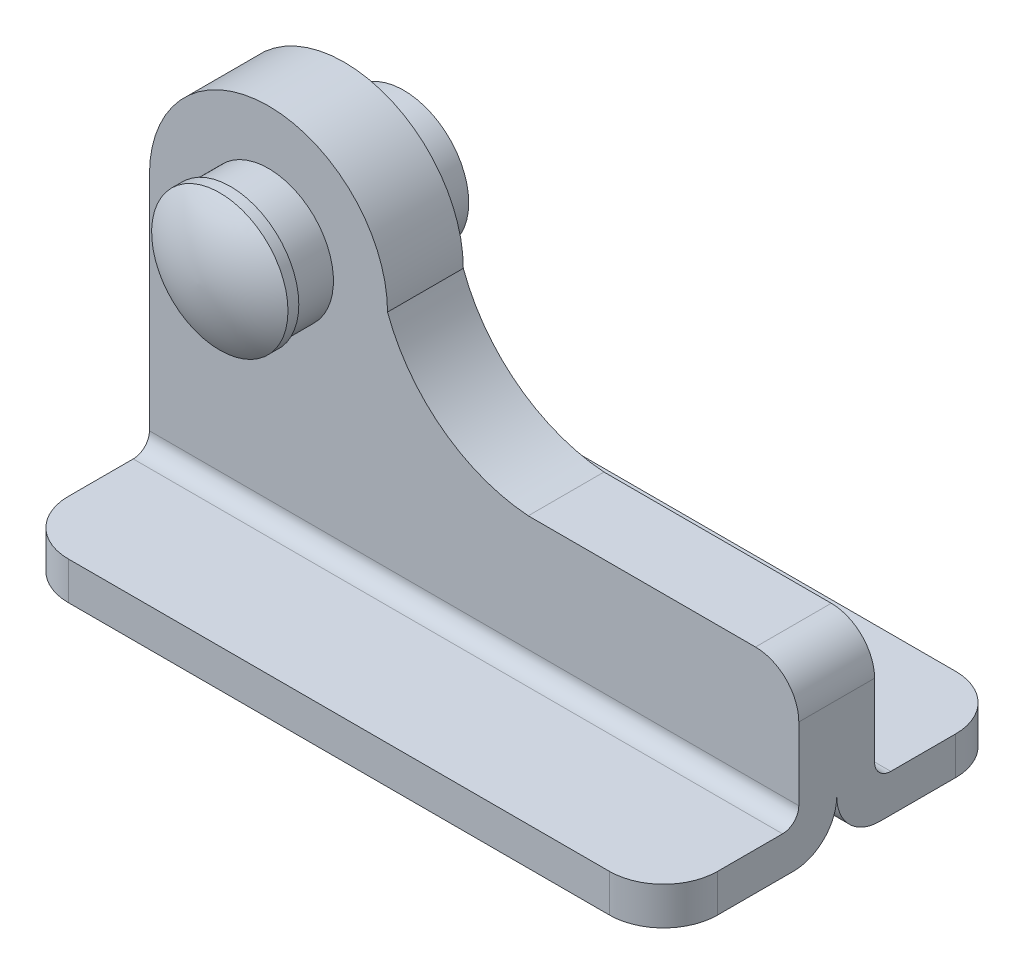
ISO-10303-21;
HEADER;
FILE_DESCRIPTION(('STEP AP214'),'2;1');
FILE_NAME('part.step','',(''),(''),'','','');
FILE_SCHEMA(('AUTOMOTIVE_DESIGN { 1 0 10303 214 1 1 1 1 }'));
ENDSEC;
DATA;
#1=APPLICATION_CONTEXT('core data for automotive mechanical design processes');
#2=APPLICATION_PROTOCOL_DEFINITION('international standard','automotive_design',2000,#1);
#3=PRODUCT_CONTEXT('',#1,'mechanical');
#4=PRODUCT('Part','Part','',(#3));
#5=PRODUCT_RELATED_PRODUCT_CATEGORY('part','',(#4));
#6=PRODUCT_DEFINITION_FORMATION('','',#4);
#7=PRODUCT_DEFINITION_CONTEXT('part definition',#1,'design');
#8=PRODUCT_DEFINITION('design','',#6,#7);
#9=PRODUCT_DEFINITION_SHAPE('','',#8);
#10=(LENGTH_UNIT() NAMED_UNIT(*) SI_UNIT(.MILLI.,.METRE.));
#11=(NAMED_UNIT(*) PLANE_ANGLE_UNIT() SI_UNIT($,.RADIAN.));
#12=(NAMED_UNIT(*) SI_UNIT($,.STERADIAN.) SOLID_ANGLE_UNIT());
#13=UNCERTAINTY_MEASURE_WITH_UNIT(LENGTH_MEASURE(1.E-05),#10,'distance_accuracy_value','');
#14=(GEOMETRIC_REPRESENTATION_CONTEXT(3) GLOBAL_UNCERTAINTY_ASSIGNED_CONTEXT((#13)) GLOBAL_UNIT_ASSIGNED_CONTEXT((#10,
#11,#12)) REPRESENTATION_CONTEXT('',''));
#15=CARTESIAN_POINT('',(0.,0.,0.));
#16=DIRECTION('',(0.,0.,1.));
#17=DIRECTION('',(1.,0.,0.));
#18=AXIS2_PLACEMENT_3D('',#15,#16,#17);
#19=CARTESIAN_POINT('',(42.1,0.,-3.5));
#20=DIRECTION('',(0.,-1.,0.));
#21=DIRECTION('',(0.,0.,-1.));
#22=AXIS2_PLACEMENT_3D('',#19,#20,#21);
#23=PLANE('',#22);
#24=DIRECTION('',(1.,0.,0.));
#25=VECTOR('',#24,1.);
#26=CARTESIAN_POINT('',(102.1,0.,16.));
#27=LINE('',#26,#25);
#28=CARTESIAN_POINT('',(47.1,0.,16.));
#29=VERTEX_POINT('',#28);
#30=CARTESIAN_POINT('',(97.1,0.,16.));
#31=VERTEX_POINT('',#30);
#32=EDGE_CURVE('E222',#29,#31,#27,.T.);
#33=ORIENTED_EDGE('',*,*,#32,.F.);
#34=CARTESIAN_POINT('',(47.1,0.,11.));
#35=DIRECTION('',(0.,-1.,0.));
#36=DIRECTION('',(0.,0.,-1.));
#37=AXIS2_PLACEMENT_3D('',#34,#35,#36);
#38=CIRCLE('',#37,5.);
#39=CARTESIAN_POINT('',(42.1,0.,11.));
#40=VERTEX_POINT('',#39);
#41=EDGE_CURVE('E343',#29,#40,#38,.T.);
#42=ORIENTED_EDGE('',*,*,#41,.T.);
#43=DIRECTION('',(0.,0.,1.));
#44=VECTOR('',#43,1.);
#45=CARTESIAN_POINT('',(42.1,0.,-3.5));
#46=LINE('',#45,#44);
#47=CARTESIAN_POINT('',(42.1,0.,4.));
#48=VERTEX_POINT('',#47);
#49=EDGE_CURVE('E275',#48,#40,#46,.T.);
#50=ORIENTED_EDGE('',*,*,#49,.F.);
#51=DIRECTION('',(-1.,0.,0.));
#52=VECTOR('',#51,1.);
#53=CARTESIAN_POINT('',(102.1,0.,4.));
#54=LINE('',#53,#52);
#55=CARTESIAN_POINT('',(102.1,0.,4.));
#56=VERTEX_POINT('',#55);
#57=EDGE_CURVE('E202',#56,#48,#54,.T.);
#58=ORIENTED_EDGE('',*,*,#57,.F.);
#59=DIRECTION('',(0.,0.,1.));
#60=VECTOR('',#59,1.);
#61=CARTESIAN_POINT('',(102.1,0.,-3.5));
#62=LINE('',#61,#60);
#63=CARTESIAN_POINT('',(102.1,0.,11.));
#64=VERTEX_POINT('',#63);
#65=EDGE_CURVE('E192',#56,#64,#62,.T.);
#66=ORIENTED_EDGE('',*,*,#65,.T.);
#67=CARTESIAN_POINT('',(97.1,0.,11.));
#68=DIRECTION('',(0.,-1.,0.));
#69=DIRECTION('',(0.,0.,-1.));
#70=AXIS2_PLACEMENT_3D('',#67,#68,#69);
#71=CIRCLE('',#70,5.);
#72=EDGE_CURVE('E341',#64,#31,#71,.T.);
#73=ORIENTED_EDGE('',*,*,#72,.T.);
#74=EDGE_LOOP('',(#33,#42,#50,#58,#66,#73));
#75=FACE_BOUND('',#74,.T.);
#76=ADVANCED_FACE('F43',(#75),#23,.T.);
#77=CARTESIAN_POINT('',(53.1,25.5,3.5));
#78=DIRECTION('',(0.,0.,1.));
#79=DIRECTION('',(1.,0.,0.));
#80=AXIS2_PLACEMENT_3D('',#77,#78,#79);
#81=PLANE('',#80);
#82=CARTESIAN_POINT('',(53.1,25.5,3.5));
#83=DIRECTION('',(0.,0.,-1.));
#84=DIRECTION('',(-1.,0.,0.));
#85=AXIS2_PLACEMENT_3D('',#82,#83,#84);
#86=CIRCLE('',#85,6.);
#87=CARTESIAN_POINT('',(47.1,25.5,3.5));
#88=VERTEX_POINT('',#87);
#89=EDGE_CURVE('E270',#88,#88,#86,.T.);
#90=ORIENTED_EDGE('',*,*,#89,.T.);
#91=EDGE_LOOP('',(#90));
#92=FACE_BOUND('',#91,.T.);
#93=DIRECTION('',(0.,1.,0.));
#94=VECTOR('',#93,1.);
#95=CARTESIAN_POINT('',(102.1,0.,3.5));
#96=LINE('',#95,#94);
#97=CARTESIAN_POINT('',(102.1,5.,3.5));
#98=VERTEX_POINT('',#97);
#99=CARTESIAN_POINT('',(102.1,11.7,3.5));
#100=VERTEX_POINT('',#99);
#101=EDGE_CURVE('E261',#98,#100,#96,.T.);
#102=ORIENTED_EDGE('',*,*,#101,.T.);
#103=CARTESIAN_POINT('',(98.1,11.7,3.5));
#104=DIRECTION('',(0.,0.,1.));
#105=DIRECTION('',(1.,0.,0.));
#106=AXIS2_PLACEMENT_3D('',#103,#104,#105);
#107=CIRCLE('',#106,4.);
#108=CARTESIAN_POINT('',(98.1,15.7,3.5));
#109=VERTEX_POINT('',#108);
#110=EDGE_CURVE('E312',#100,#109,#107,.T.);
#111=ORIENTED_EDGE('',*,*,#110,.T.);
#112=DIRECTION('',(-1.,0.,0.));
#113=VECTOR('',#112,1.);
#114=CARTESIAN_POINT('',(102.1,15.7,3.5));
#115=LINE('',#114,#113);
#116=CARTESIAN_POINT('',(77.1,15.7,3.5));
#117=VERTEX_POINT('',#116);
#118=EDGE_CURVE('E264',#109,#117,#115,.T.);
#119=ORIENTED_EDGE('',*,*,#118,.T.);
#120=CARTESIAN_POINT('',(78.1842659266962,30.6607609231685,3.5));
#121=DIRECTION('',(0.,0.,-1.));
#122=DIRECTION('',(-1.,0.,0.));
#123=AXIS2_PLACEMENT_3D('',#120,#121,#122);
#124=CIRCLE('',#123,15.);
#125=CARTESIAN_POINT('',(64.1,25.5,3.5));
#126=VERTEX_POINT('',#125);
#127=EDGE_CURVE('E244',#117,#126,#124,.T.);
#128=ORIENTED_EDGE('',*,*,#127,.T.);
#129=CARTESIAN_POINT('',(53.1,25.5,3.5));
#130=DIRECTION('',(0.,0.,1.));
#131=DIRECTION('',(1.,0.,0.));
#132=AXIS2_PLACEMENT_3D('',#129,#130,#131);
#133=CIRCLE('',#132,11.);
#134=CARTESIAN_POINT('',(42.1,25.5,3.5));
#135=VERTEX_POINT('',#134);
#136=EDGE_CURVE('E239',#126,#135,#133,.T.);
#137=ORIENTED_EDGE('',*,*,#136,.T.);
#138=DIRECTION('',(0.,-1.,0.));
#139=VECTOR('',#138,1.);
#140=CARTESIAN_POINT('',(42.1,25.5,3.5));
#141=LINE('',#140,#139);
#142=CARTESIAN_POINT('',(42.1,5.,3.5));
#143=VERTEX_POINT('',#142);
#144=EDGE_CURVE('E258',#135,#143,#141,.T.);
#145=ORIENTED_EDGE('',*,*,#144,.T.);
#146=DIRECTION('',(-1.,0.,0.));
#147=VECTOR('',#146,1.);
#148=CARTESIAN_POINT('',(53.1,5.,3.5));
#149=LINE('',#148,#147);
#150=EDGE_CURVE('E292',#143,#98,#149,.F.);
#151=ORIENTED_EDGE('',*,*,#150,.T.);
#152=EDGE_LOOP('',(#102,#111,#119,#128,#137,#145,#151));
#153=FACE_BOUND('',#152,.T.);
#154=ADVANCED_FACE('F377',(#92,#153),#81,.T.);
#155=CARTESIAN_POINT('',(53.1,25.5,-3.5));
#156=DIRECTION('',(0.,0.,1.));
#157=DIRECTION('',(1.,0.,0.));
#158=AXIS2_PLACEMENT_3D('',#155,#156,#157);
#159=PLANE('',#158);
#160=CARTESIAN_POINT('',(53.1,25.5,-3.49999999999999));
#161=DIRECTION('',(0.,0.,1.));
#162=DIRECTION('',(1.,0.,0.));
#163=AXIS2_PLACEMENT_3D('',#160,#161,#162);
#164=CIRCLE('',#163,5.99999999999999);
#165=CARTESIAN_POINT('',(59.1,25.5,-3.5));
#166=VERTEX_POINT('',#165);
#167=EDGE_CURVE('E440',#166,#166,#164,.T.);
#168=ORIENTED_EDGE('',*,*,#167,.T.);
#169=EDGE_LOOP('',(#168));
#170=FACE_BOUND('',#169,.T.);
#171=DIRECTION('',(-1.,0.,0.));
#172=VECTOR('',#171,1.);
#173=CARTESIAN_POINT('',(102.1,15.7,-3.5));
#174=LINE('',#173,#172);
#175=CARTESIAN_POINT('',(98.1,15.7,-3.5));
#176=VERTEX_POINT('',#175);
#177=CARTESIAN_POINT('',(77.1,15.7,-3.5));
#178=VERTEX_POINT('',#177);
#179=EDGE_CURVE('E250',#176,#178,#174,.T.);
#180=ORIENTED_EDGE('',*,*,#179,.F.);
#181=CARTESIAN_POINT('',(98.1,11.7,-3.5));
#182=DIRECTION('',(0.,0.,1.));
#183=DIRECTION('',(1.,0.,0.));
#184=AXIS2_PLACEMENT_3D('',#181,#182,#183);
#185=CIRCLE('',#184,4.);
#186=CARTESIAN_POINT('',(102.1,11.7,-3.5));
#187=VERTEX_POINT('',#186);
#188=EDGE_CURVE('E316',#176,#187,#185,.F.);
#189=ORIENTED_EDGE('',*,*,#188,.T.);
#190=DIRECTION('',(0.,1.,0.));
#191=VECTOR('',#190,1.);
#192=CARTESIAN_POINT('',(102.1,0.,-3.5));
#193=LINE('',#192,#191);
#194=CARTESIAN_POINT('',(102.1,5.,-3.5));
#195=VERTEX_POINT('',#194);
#196=EDGE_CURVE('E247',#195,#187,#193,.T.);
#197=ORIENTED_EDGE('',*,*,#196,.F.);
#198=DIRECTION('',(1.,0.,0.));
#199=VECTOR('',#198,1.);
#200=CARTESIAN_POINT('',(42.1,5.,-3.5));
#201=LINE('',#200,#199);
#202=CARTESIAN_POINT('',(42.1,5.,-3.5));
#203=VERTEX_POINT('',#202);
#204=EDGE_CURVE('E297',#195,#203,#201,.F.);
#205=ORIENTED_EDGE('',*,*,#204,.T.);
#206=DIRECTION('',(0.,-1.,0.));
#207=VECTOR('',#206,1.);
#208=CARTESIAN_POINT('',(42.1,25.5,-3.5));
#209=LINE('',#208,#207);
#210=CARTESIAN_POINT('',(42.1,25.5,-3.5));
#211=VERTEX_POINT('',#210);
#212=EDGE_CURVE('E243',#211,#203,#209,.T.);
#213=ORIENTED_EDGE('',*,*,#212,.F.);
#214=CARTESIAN_POINT('',(53.1,25.5,-3.5));
#215=DIRECTION('',(0.,0.,1.));
#216=DIRECTION('',(1.,0.,0.));
#217=AXIS2_PLACEMENT_3D('',#214,#215,#216);
#218=CIRCLE('',#217,11.);
#219=CARTESIAN_POINT('',(64.1,25.5,-3.5));
#220=VERTEX_POINT('',#219);
#221=EDGE_CURVE('E240',#220,#211,#218,.T.);
#222=ORIENTED_EDGE('',*,*,#221,.F.);
#223=CARTESIAN_POINT('',(78.1842659266962,30.6607609231685,-3.5));
#224=DIRECTION('',(0.,0.,-1.));
#225=DIRECTION('',(-1.,0.,0.));
#226=AXIS2_PLACEMENT_3D('',#223,#224,#225);
#227=CIRCLE('',#226,15.);
#228=EDGE_CURVE('E252',#178,#220,#227,.T.);
#229=ORIENTED_EDGE('',*,*,#228,.F.);
#230=EDGE_LOOP('',(#180,#189,#197,#205,#213,#222,#229));
#231=FACE_BOUND('',#230,.T.);
#232=ADVANCED_FACE('F382',(#170,#231),#159,.F.);
#233=CARTESIAN_POINT('',(52.8855499827584,25.5,-1.59801755431101));
#234=DIRECTION('',(0.,1.,0.));
#235=DIRECTION('',(1.,0.,0.));
#236=AXIS2_PLACEMENT_3D('',#233,#234,#235);
#237=CIRCLE('',#236,11.6);
#238=TRIMMED_CURVE('',#237,(PARAMETER_VALUE(-1.55230820312123)),
(PARAMETER_VALUE(1.55230820312123)),.T.,.PARAMETER.);
#239=CARTESIAN_POINT('',(53.1,25.5,-1.59801755431101));
#240=DIRECTION('',(0.,0.,-1.));
#241=AXIS1_PLACEMENT('',#239,#240);
#242=SURFACE_OF_REVOLUTION('',#238,#241);
#243=CARTESIAN_POINT('',(53.1,25.5,8.));
#244=DIRECTION('',(0.,0.,-1.));
#245=DIRECTION('',(0.,-1.,0.));
#246=AXIS2_PLACEMENT_3D('',#243,#244,#245);
#247=CIRCLE('',#246,6.3);
#248=CARTESIAN_POINT('',(53.1,19.2,8.));
#249=VERTEX_POINT('',#248);
#250=EDGE_CURVE('E284',#249,#249,#247,.T.);
#251=ORIENTED_EDGE('',*,*,#250,.F.);
#252=EDGE_LOOP('',(#251));
#253=FACE_BOUND('',#252,.T.);
#254=CARTESIAN_POINT('',(53.1,25.5,10.));
#255=VERTEX_POINT('',#254);
#256=VERTEX_LOOP('',#255);
#257=FACE_BOUND('',#256,.T.);
#258=ADVANCED_FACE('F407',(#253,#257),#242,.T.);
#259=CARTESIAN_POINT('',(53.1,25.5,7.));
#260=DIRECTION('',(0.,0.,1.));
#261=DIRECTION('',(1.,0.,0.));
#262=AXIS2_PLACEMENT_3D('',#259,#260,#261);
#263=CYLINDRICAL_SURFACE('',#262,6.3);
#264=CARTESIAN_POINT('',(53.1,25.5,7.));
#265=DIRECTION('',(0.,0.,-1.));
#266=DIRECTION('',(-1.,0.,0.));
#267=AXIS2_PLACEMENT_3D('',#264,#265,#266);
#268=CIRCLE('',#267,6.3);
#269=CARTESIAN_POINT('',(46.8,25.5,7.));
#270=VERTEX_POINT('',#269);
#271=EDGE_CURVE('E279',#270,#270,#268,.T.);
#272=ORIENTED_EDGE('',*,*,#271,.F.);
#273=EDGE_LOOP('',(#272));
#274=FACE_BOUND('',#273,.T.);
#275=ORIENTED_EDGE('',*,*,#250,.T.);
#276=EDGE_LOOP('',(#275));
#277=FACE_BOUND('',#276,.T.);
#278=ADVANCED_FACE('F494',(#274,#277),#263,.T.);
#279=CARTESIAN_POINT('',(53.1,25.5,7.));
#280=DIRECTION('',(0.,0.,-1.));
#281=DIRECTION('',(-1.,0.,0.));
#282=AXIS2_PLACEMENT_3D('',#279,#280,#281);
#283=PLANE('',#282);
#284=CARTESIAN_POINT('',(53.1,25.5,7.));
#285=DIRECTION('',(0.,0.,-1.));
#286=DIRECTION('',(-1.,0.,0.));
#287=AXIS2_PLACEMENT_3D('',#284,#285,#286);
#288=CIRCLE('',#287,6.);
#289=CARTESIAN_POINT('',(47.1,25.5,7.));
#290=VERTEX_POINT('',#289);
#291=EDGE_CURVE('E280',#290,#290,#288,.T.);
#292=ORIENTED_EDGE('',*,*,#291,.F.);
#293=EDGE_LOOP('',(#292));
#294=FACE_BOUND('',#293,.T.);
#295=ORIENTED_EDGE('',*,*,#271,.T.);
#296=EDGE_LOOP('',(#295));
#297=FACE_BOUND('',#296,.T.);
#298=ADVANCED_FACE('F498',(#294,#297),#283,.T.);
#299=CARTESIAN_POINT('',(53.1,25.5,3.5));
#300=DIRECTION('',(0.,0.,1.));
#301=DIRECTION('',(1.,0.,0.));
#302=AXIS2_PLACEMENT_3D('',#299,#300,#301);
#303=CYLINDRICAL_SURFACE('',#302,6.);
#304=ORIENTED_EDGE('',*,*,#89,.F.);
#305=EDGE_LOOP('',(#304));
#306=FACE_BOUND('',#305,.T.);
#307=ORIENTED_EDGE('',*,*,#291,.T.);
#308=EDGE_LOOP('',(#307));
#309=FACE_BOUND('',#308,.T.);
#310=ADVANCED_FACE('F502',(#306,#309),#303,.T.);
#311=CARTESIAN_POINT('',(53.1,25.5,-3.5));
#312=DIRECTION('',(0.,0.,1.));
#313=DIRECTION('',(1.,0.,0.));
#314=AXIS2_PLACEMENT_3D('',#311,#312,#313);
#315=CYLINDRICAL_SURFACE('',#314,11.);
#316=ORIENTED_EDGE('',*,*,#136,.F.);
#317=DIRECTION('',(0.,0.,1.));
#318=VECTOR('',#317,1.);
#319=CARTESIAN_POINT('',(64.1,25.5,-3.5));
#320=LINE('',#319,#318);
#321=EDGE_CURVE('E268',#220,#126,#320,.T.);
#322=ORIENTED_EDGE('',*,*,#321,.F.);
#323=ORIENTED_EDGE('',*,*,#221,.T.);
#324=DIRECTION('',(0.,0.,1.));
#325=VECTOR('',#324,1.);
#326=CARTESIAN_POINT('',(42.1,25.5,-3.5));
#327=LINE('',#326,#325);
#328=EDGE_CURVE('E255',#211,#135,#327,.T.);
#329=ORIENTED_EDGE('',*,*,#328,.T.);
#330=EDGE_LOOP('',(#316,#322,#323,#329));
#331=FACE_BOUND('',#330,.T.);
#332=ADVANCED_FACE('F402',(#331),#315,.T.);
#333=CARTESIAN_POINT('',(78.1842659266962,30.6607609231685,-3.5));
#334=DIRECTION('',(0.,0.,1.));
#335=DIRECTION('',(1.,0.,0.));
#336=AXIS2_PLACEMENT_3D('',#333,#334,#335);
#337=CYLINDRICAL_SURFACE('',#336,15.);
#338=ORIENTED_EDGE('',*,*,#127,.F.);
#339=DIRECTION('',(0.,0.,1.));
#340=VECTOR('',#339,1.);
#341=CARTESIAN_POINT('',(77.1,15.7,-3.5));
#342=LINE('',#341,#340);
#343=EDGE_CURVE('E191',#178,#117,#342,.T.);
#344=ORIENTED_EDGE('',*,*,#343,.F.);
#345=ORIENTED_EDGE('',*,*,#228,.T.);
#346=ORIENTED_EDGE('',*,*,#321,.T.);
#347=EDGE_LOOP('',(#338,#344,#345,#346));
#348=FACE_BOUND('',#347,.T.);
#349=ADVANCED_FACE('F397',(#348),#337,.F.);
#350=CARTESIAN_POINT('',(102.1,15.7,-3.5));
#351=DIRECTION('',(0.,1.,0.));
#352=DIRECTION('',(0.,0.,1.));
#353=AXIS2_PLACEMENT_3D('',#350,#351,#352);
#354=PLANE('',#353);
#355=ORIENTED_EDGE('',*,*,#118,.F.);
#356=DIRECTION('',(0.,0.,1.));
#357=VECTOR('',#356,1.);
#358=CARTESIAN_POINT('',(98.1,15.7,-3.5));
#359=LINE('',#358,#357);
#360=EDGE_CURVE('E314',#109,#176,#359,.F.);
#361=ORIENTED_EDGE('',*,*,#360,.T.);
#362=ORIENTED_EDGE('',*,*,#179,.T.);
#363=ORIENTED_EDGE('',*,*,#343,.T.);
#364=EDGE_LOOP('',(#355,#361,#362,#363));
#365=FACE_BOUND('',#364,.T.);
#366=ADVANCED_FACE('F393',(#365),#354,.T.);
#367=CARTESIAN_POINT('',(102.1,0.,-3.5));
#368=DIRECTION('',(1.,0.,0.));
#369=DIRECTION('',(0.,0.,-1.));
#370=AXIS2_PLACEMENT_3D('',#367,#368,#369);
#371=PLANE('',#370);
#372=CARTESIAN_POINT('',(102.1,0.,-11.));
#373=VERTEX_POINT('',#372);
#374=CARTESIAN_POINT('',(102.1,0.,-4.));
#375=VERTEX_POINT('',#374);
#376=EDGE_CURVE('E182',#373,#375,#62,.T.);
#377=ORIENTED_EDGE('',*,*,#376,.F.);
#378=DIRECTION('',(0.,-1.,0.));
#379=VECTOR('',#378,1.);
#380=CARTESIAN_POINT('',(102.1,3.5,-11.));
#381=LINE('',#380,#379);
#382=CARTESIAN_POINT('',(102.1,3.5,-11.));
#383=VERTEX_POINT('',#382);
#384=EDGE_CURVE('E12',#373,#383,#381,.F.);
#385=ORIENTED_EDGE('',*,*,#384,.T.);
#386=DIRECTION('',(0.,0.,1.));
#387=VECTOR('',#386,1.);
#388=CARTESIAN_POINT('',(102.1,3.5,-16.));
#389=LINE('',#388,#387);
#390=CARTESIAN_POINT('',(102.1,3.5,-5.));
#391=VERTEX_POINT('',#390);
#392=EDGE_CURVE('E235',#383,#391,#389,.T.);
#393=ORIENTED_EDGE('',*,*,#392,.T.);
#394=CARTESIAN_POINT('',(102.1,5.,-5.));
#395=DIRECTION('',(1.,0.,0.));
#396=DIRECTION('',(0.,0.,-1.));
#397=AXIS2_PLACEMENT_3D('',#394,#395,#396);
#398=CIRCLE('',#397,1.5);
#399=EDGE_CURVE('E304',#391,#195,#398,.F.);
#400=ORIENTED_EDGE('',*,*,#399,.T.);
#401=ORIENTED_EDGE('',*,*,#196,.T.);
#402=DIRECTION('',(0.,0.,1.));
#403=VECTOR('',#402,1.);
#404=CARTESIAN_POINT('',(102.1,11.7,-3.5));
#405=LINE('',#404,#403);
#406=EDGE_CURVE('E309',#187,#100,#405,.T.);
#407=ORIENTED_EDGE('',*,*,#406,.T.);
#408=ORIENTED_EDGE('',*,*,#101,.F.);
#409=CARTESIAN_POINT('',(102.1,5.,5.));
#410=DIRECTION('',(1.,0.,0.));
#411=DIRECTION('',(0.,0.,-1.));
#412=AXIS2_PLACEMENT_3D('',#409,#410,#411);
#413=CIRCLE('',#412,1.5);
#414=CARTESIAN_POINT('',(102.1,3.5,5.));
#415=VERTEX_POINT('',#414);
#416=EDGE_CURVE('E301',#98,#415,#413,.F.);
#417=ORIENTED_EDGE('',*,*,#416,.T.);
#418=DIRECTION('',(0.,0.,-1.));
#419=VECTOR('',#418,1.);
#420=CARTESIAN_POINT('',(102.1,3.5,16.));
#421=LINE('',#420,#419);
#422=CARTESIAN_POINT('',(102.1,3.5,11.));
#423=VERTEX_POINT('',#422);
#424=EDGE_CURVE('E227',#423,#415,#421,.T.);
#425=ORIENTED_EDGE('',*,*,#424,.F.);
#426=DIRECTION('',(0.,1.,0.));
#427=VECTOR('',#426,1.);
#428=CARTESIAN_POINT('',(102.1,0.,11.));
#429=LINE('',#428,#427);
#430=EDGE_CURVE('E51',#423,#64,#429,.F.);
#431=ORIENTED_EDGE('',*,*,#430,.T.);
#432=ORIENTED_EDGE('',*,*,#65,.F.);
#433=CARTESIAN_POINT('',(102.1,4.,4.));
#434=DIRECTION('',(1.,0.,0.));
#435=DIRECTION('',(0.,0.,-1.));
#436=AXIS2_PLACEMENT_3D('',#433,#434,#435);
#437=CIRCLE('',#436,4.);
#438=CARTESIAN_POINT('',(102.1,4.,0.));
#439=VERTEX_POINT('',#438);
#440=EDGE_CURVE('E203',#56,#439,#437,.T.);
#441=ORIENTED_EDGE('',*,*,#440,.T.);
#442=CARTESIAN_POINT('',(102.1,4.,-4.));
#443=DIRECTION('',(1.,0.,0.));
#444=DIRECTION('',(0.,0.,-1.));
#445=AXIS2_PLACEMENT_3D('',#442,#443,#444);
#446=CIRCLE('',#445,4.);
#447=EDGE_CURVE('E198',#439,#375,#446,.T.);
#448=ORIENTED_EDGE('',*,*,#447,.T.);
#449=EDGE_LOOP('',(#377,#385,#393,#400,#401,#407,#408,#417,#425,#431,#432,#441,#448));
#450=FACE_BOUND('',#449,.T.);
#451=ADVANCED_FACE('F205',(#450),#371,.T.);
#452=CARTESIAN_POINT('',(42.1,0.,-11.));
#453=VERTEX_POINT('',#452);
#454=CARTESIAN_POINT('',(42.1,0.,-4.));
#455=VERTEX_POINT('',#454);
#456=EDGE_CURVE('E273',#453,#455,#46,.T.);
#457=ORIENTED_EDGE('',*,*,#456,.F.);
#458=CARTESIAN_POINT('',(47.1,0.,-11.));
#459=DIRECTION('',(0.,-1.,0.));
#460=DIRECTION('',(0.,0.,-1.));
#461=AXIS2_PLACEMENT_3D('',#458,#459,#460);
#462=CIRCLE('',#461,5.);
#463=CARTESIAN_POINT('',(47.1,0.,-16.));
#464=VERTEX_POINT('',#463);
#465=EDGE_CURVE('E333',#453,#464,#462,.T.);
#466=ORIENTED_EDGE('',*,*,#465,.T.);
#467=DIRECTION('',(-1.,0.,0.));
#468=VECTOR('',#467,1.);
#469=CARTESIAN_POINT('',(42.1,0.,-16.));
#470=LINE('',#469,#468);
#471=CARTESIAN_POINT('',(97.1,0.,-16.));
#472=VERTEX_POINT('',#471);
#473=EDGE_CURVE('E229',#472,#464,#470,.T.);
#474=ORIENTED_EDGE('',*,*,#473,.F.);
#475=CARTESIAN_POINT('',(97.1,0.,-11.));
#476=DIRECTION('',(0.,-1.,0.));
#477=DIRECTION('',(0.,0.,-1.));
#478=AXIS2_PLACEMENT_3D('',#475,#476,#477);
#479=CIRCLE('',#478,5.);
#480=EDGE_CURVE('E188',#472,#373,#479,.T.);
#481=ORIENTED_EDGE('',*,*,#480,.T.);
#482=ORIENTED_EDGE('',*,*,#376,.T.);
#483=DIRECTION('',(-1.,0.,0.));
#484=VECTOR('',#483,1.);
#485=CARTESIAN_POINT('',(102.1,0.,-4.));
#486=LINE('',#485,#484);
#487=EDGE_CURVE('E186',#375,#455,#486,.T.);
#488=ORIENTED_EDGE('',*,*,#487,.T.);
#489=EDGE_LOOP('',(#457,#466,#474,#481,#482,#488));
#490=FACE_BOUND('',#489,.T.);
#491=ADVANCED_FACE('F185',(#490),#23,.T.);
#492=CARTESIAN_POINT('',(42.1,25.5,-3.5));
#493=DIRECTION('',(-1.,0.,0.));
#494=DIRECTION('',(0.,0.,1.));
#495=AXIS2_PLACEMENT_3D('',#492,#493,#494);
#496=PLANE('',#495);
#497=DIRECTION('',(0.,0.,1.));
#498=VECTOR('',#497,1.);
#499=CARTESIAN_POINT('',(42.1,3.5,-16.));
#500=LINE('',#499,#498);
#501=CARTESIAN_POINT('',(42.1,3.5,-11.));
#502=VERTEX_POINT('',#501);
#503=CARTESIAN_POINT('',(42.1,3.5,-5.));
#504=VERTEX_POINT('',#503);
#505=EDGE_CURVE('E237',#502,#504,#500,.T.);
#506=ORIENTED_EDGE('',*,*,#505,.F.);
#507=DIRECTION('',(0.,1.,0.));
#508=VECTOR('',#507,1.);
#509=CARTESIAN_POINT('',(42.1,0.,-11.));
#510=LINE('',#509,#508);
#511=EDGE_CURVE('E330',#502,#453,#510,.F.);
#512=ORIENTED_EDGE('',*,*,#511,.T.);
#513=ORIENTED_EDGE('',*,*,#456,.T.);
#514=CARTESIAN_POINT('',(42.1,4.,-4.));
#515=DIRECTION('',(1.,0.,0.));
#516=DIRECTION('',(0.,0.,-1.));
#517=AXIS2_PLACEMENT_3D('',#514,#515,#516);
#518=CIRCLE('',#517,4.);
#519=CARTESIAN_POINT('',(42.1,4.,0.));
#520=VERTEX_POINT('',#519);
#521=EDGE_CURVE('E201',#520,#455,#518,.T.);
#522=ORIENTED_EDGE('',*,*,#521,.F.);
#523=CARTESIAN_POINT('',(42.1,4.,4.));
#524=DIRECTION('',(1.,0.,0.));
#525=DIRECTION('',(0.,0.,-1.));
#526=AXIS2_PLACEMENT_3D('',#523,#524,#525);
#527=CIRCLE('',#526,4.);
#528=EDGE_CURVE('E206',#48,#520,#527,.T.);
#529=ORIENTED_EDGE('',*,*,#528,.F.);
#530=ORIENTED_EDGE('',*,*,#49,.T.);
#531=DIRECTION('',(0.,-1.,0.));
#532=VECTOR('',#531,1.);
#533=CARTESIAN_POINT('',(42.1,3.5,11.));
#534=LINE('',#533,#532);
#535=CARTESIAN_POINT('',(42.1,3.5,11.));
#536=VERTEX_POINT('',#535);
#537=EDGE_CURVE('E328',#40,#536,#534,.F.);
#538=ORIENTED_EDGE('',*,*,#537,.T.);
#539=DIRECTION('',(0.,0.,-1.));
#540=VECTOR('',#539,1.);
#541=CARTESIAN_POINT('',(42.1,3.5,16.));
#542=LINE('',#541,#540);
#543=CARTESIAN_POINT('',(42.1,3.5,5.));
#544=VERTEX_POINT('',#543);
#545=EDGE_CURVE('E225',#536,#544,#542,.T.);
#546=ORIENTED_EDGE('',*,*,#545,.T.);
#547=CARTESIAN_POINT('',(42.1,5.,5.));
#548=DIRECTION('',(-1.,0.,0.));
#549=DIRECTION('',(0.,0.,1.));
#550=AXIS2_PLACEMENT_3D('',#547,#548,#549);
#551=CIRCLE('',#550,1.5);
#552=EDGE_CURVE('E299',#544,#143,#551,.F.);
#553=ORIENTED_EDGE('',*,*,#552,.T.);
#554=ORIENTED_EDGE('',*,*,#144,.F.);
#555=ORIENTED_EDGE('',*,*,#328,.F.);
#556=ORIENTED_EDGE('',*,*,#212,.T.);
#557=CARTESIAN_POINT('',(42.1,5.,-5.));
#558=DIRECTION('',(-1.,0.,0.));
#559=DIRECTION('',(0.,0.,1.));
#560=AXIS2_PLACEMENT_3D('',#557,#558,#559);
#561=CIRCLE('',#560,1.5);
#562=EDGE_CURVE('E306',#203,#504,#561,.F.);
#563=ORIENTED_EDGE('',*,*,#562,.T.);
#564=EDGE_LOOP('',(#506,#512,#513,#522,#529,#530,#538,#546,#553,#554,#555,#556,#563));
#565=FACE_BOUND('',#564,.T.);
#566=ADVANCED_FACE('F365',(#565),#496,.T.);
#567=CARTESIAN_POINT('',(102.1,3.5,-16.));
#568=DIRECTION('',(0.,-1.,0.));
#569=DIRECTION('',(1.,0.,0.));
#570=AXIS2_PLACEMENT_3D('',#567,#568,#569);
#571=PLANE('',#570);
#572=DIRECTION('',(1.,0.,0.));
#573=VECTOR('',#572,1.);
#574=CARTESIAN_POINT('',(102.1,3.5,-16.));
#575=LINE('',#574,#573);
#576=CARTESIAN_POINT('',(47.1,3.5,-16.));
#577=VERTEX_POINT('',#576);
#578=CARTESIAN_POINT('',(97.1,3.5,-16.));
#579=VERTEX_POINT('',#578);
#580=EDGE_CURVE('E232',#577,#579,#575,.T.);
#581=ORIENTED_EDGE('',*,*,#580,.F.);
#582=CARTESIAN_POINT('',(47.1,3.5,-11.));
#583=DIRECTION('',(0.,-1.,0.));
#584=DIRECTION('',(1.,0.,0.));
#585=AXIS2_PLACEMENT_3D('',#582,#583,#584);
#586=CIRCLE('',#585,5.);
#587=EDGE_CURVE('E326',#577,#502,#586,.F.);
#588=ORIENTED_EDGE('',*,*,#587,.T.);
#589=ORIENTED_EDGE('',*,*,#505,.T.);
#590=DIRECTION('',(1.,0.,0.));
#591=VECTOR('',#590,1.);
#592=CARTESIAN_POINT('',(102.1,3.5,-5.));
#593=LINE('',#592,#591);
#594=EDGE_CURVE('E294',#504,#391,#593,.T.);
#595=ORIENTED_EDGE('',*,*,#594,.T.);
#596=ORIENTED_EDGE('',*,*,#392,.F.);
#597=CARTESIAN_POINT('',(97.1,3.5,-11.));
#598=DIRECTION('',(0.,-1.,0.));
#599=DIRECTION('',(1.,0.,0.));
#600=AXIS2_PLACEMENT_3D('',#597,#598,#599);
#601=CIRCLE('',#600,5.);
#602=EDGE_CURVE('E324',#383,#579,#601,.F.);
#603=ORIENTED_EDGE('',*,*,#602,.T.);
#604=EDGE_LOOP('',(#581,#588,#589,#595,#596,#603));
#605=FACE_BOUND('',#604,.T.);
#606=ADVANCED_FACE('F392',(#605),#571,.F.);
#607=CARTESIAN_POINT('',(0.,0.,-16.));
#608=DIRECTION('',(0.,0.,1.));
#609=DIRECTION('',(1.,0.,0.));
#610=AXIS2_PLACEMENT_3D('',#607,#608,#609);
#611=PLANE('',#610);
#612=ORIENTED_EDGE('',*,*,#473,.T.);
#613=DIRECTION('',(0.,1.,0.));
#614=VECTOR('',#613,1.);
#615=CARTESIAN_POINT('',(47.1,3.5,-16.));
#616=LINE('',#615,#614);
#617=EDGE_CURVE('E321',#464,#577,#616,.T.);
#618=ORIENTED_EDGE('',*,*,#617,.T.);
#619=ORIENTED_EDGE('',*,*,#580,.T.);
#620=DIRECTION('',(0.,-1.,0.));
#621=VECTOR('',#620,1.);
#622=CARTESIAN_POINT('',(97.1,0.,-16.));
#623=LINE('',#622,#621);
#624=EDGE_CURVE('E318',#579,#472,#623,.T.);
#625=ORIENTED_EDGE('',*,*,#624,.T.);
#626=EDGE_LOOP('',(#612,#618,#619,#625));
#627=FACE_BOUND('',#626,.T.);
#628=ADVANCED_FACE('F411',(#627),#611,.F.);
#629=CARTESIAN_POINT('',(42.1,3.5,16.));
#630=DIRECTION('',(0.,-1.,0.));
#631=DIRECTION('',(0.,0.,-1.));
#632=AXIS2_PLACEMENT_3D('',#629,#630,#631);
#633=PLANE('',#632);
#634=ORIENTED_EDGE('',*,*,#545,.F.);
#635=CARTESIAN_POINT('',(47.1,3.5,11.));
#636=DIRECTION('',(0.,-1.,0.));
#637=DIRECTION('',(0.,0.,-1.));
#638=AXIS2_PLACEMENT_3D('',#635,#636,#637);
#639=CIRCLE('',#638,5.);
#640=CARTESIAN_POINT('',(47.1,3.5,16.));
#641=VERTEX_POINT('',#640);
#642=EDGE_CURVE('E346',#536,#641,#639,.F.);
#643=ORIENTED_EDGE('',*,*,#642,.T.);
#644=DIRECTION('',(-1.,0.,0.));
#645=VECTOR('',#644,1.);
#646=CARTESIAN_POINT('',(42.1,3.5,16.));
#647=LINE('',#646,#645);
#648=CARTESIAN_POINT('',(97.1,3.5,16.));
#649=VERTEX_POINT('',#648);
#650=EDGE_CURVE('E218',#649,#641,#647,.T.);
#651=ORIENTED_EDGE('',*,*,#650,.F.);
#652=CARTESIAN_POINT('',(97.1,3.5,11.));
#653=DIRECTION('',(0.,-1.,0.));
#654=DIRECTION('',(0.,0.,-1.));
#655=AXIS2_PLACEMENT_3D('',#652,#653,#654);
#656=CIRCLE('',#655,5.);
#657=EDGE_CURVE('E58',#649,#423,#656,.F.);
#658=ORIENTED_EDGE('',*,*,#657,.T.);
#659=ORIENTED_EDGE('',*,*,#424,.T.);
#660=DIRECTION('',(-1.,0.,0.));
#661=VECTOR('',#660,1.);
#662=CARTESIAN_POINT('',(42.1,3.5,5.));
#663=LINE('',#662,#661);
#664=EDGE_CURVE('E283',#415,#544,#663,.T.);
#665=ORIENTED_EDGE('',*,*,#664,.T.);
#666=EDGE_LOOP('',(#634,#643,#651,#658,#659,#665));
#667=FACE_BOUND('',#666,.T.);
#668=ADVANCED_FACE('F349',(#667),#633,.F.);
#669=CARTESIAN_POINT('',(0.,0.,16.));
#670=DIRECTION('',(0.,0.,-1.));
#671=DIRECTION('',(-1.,0.,0.));
#672=AXIS2_PLACEMENT_3D('',#669,#670,#671);
#673=PLANE('',#672);
#674=ORIENTED_EDGE('',*,*,#650,.T.);
#675=DIRECTION('',(0.,-1.,0.));
#676=VECTOR('',#675,1.);
#677=CARTESIAN_POINT('',(47.1,0.,16.));
#678=LINE('',#677,#676);
#679=EDGE_CURVE('E338',#641,#29,#678,.T.);
#680=ORIENTED_EDGE('',*,*,#679,.T.);
#681=ORIENTED_EDGE('',*,*,#32,.T.);
#682=DIRECTION('',(0.,1.,0.));
#683=VECTOR('',#682,1.);
#684=CARTESIAN_POINT('',(97.1,3.5,16.));
#685=LINE('',#684,#683);
#686=EDGE_CURVE('E335',#31,#649,#685,.T.);
#687=ORIENTED_EDGE('',*,*,#686,.T.);
#688=EDGE_LOOP('',(#674,#680,#681,#687));
#689=FACE_BOUND('',#688,.T.);
#690=ADVANCED_FACE('F354',(#689),#673,.F.);
#691=CARTESIAN_POINT('',(102.1,4.,-4.));
#692=DIRECTION('',(-1.,0.,0.));
#693=DIRECTION('',(0.,0.,1.));
#694=AXIS2_PLACEMENT_3D('',#691,#692,#693);
#695=CYLINDRICAL_SURFACE('',#694,4.);
#696=ORIENTED_EDGE('',*,*,#521,.T.);
#697=ORIENTED_EDGE('',*,*,#487,.F.);
#698=ORIENTED_EDGE('',*,*,#447,.F.);
#699=DIRECTION('',(-1.,0.,0.));
#700=VECTOR('',#699,1.);
#701=CARTESIAN_POINT('',(102.1,4.,0.));
#702=LINE('',#701,#700);
#703=EDGE_CURVE('E216',#439,#520,#702,.T.);
#704=ORIENTED_EDGE('',*,*,#703,.T.);
#705=EDGE_LOOP('',(#696,#697,#698,#704));
#706=FACE_BOUND('',#705,.T.);
#707=ADVANCED_FACE('F197',(#706),#695,.T.);
#708=CARTESIAN_POINT('',(102.1,4.,4.));
#709=DIRECTION('',(-1.,0.,0.));
#710=DIRECTION('',(0.,0.,1.));
#711=AXIS2_PLACEMENT_3D('',#708,#709,#710);
#712=CYLINDRICAL_SURFACE('',#711,4.);
#713=ORIENTED_EDGE('',*,*,#528,.T.);
#714=ORIENTED_EDGE('',*,*,#703,.F.);
#715=ORIENTED_EDGE('',*,*,#440,.F.);
#716=ORIENTED_EDGE('',*,*,#57,.T.);
#717=EDGE_LOOP('',(#713,#714,#715,#716));
#718=FACE_BOUND('',#717,.T.);
#719=ADVANCED_FACE('F367',(#718),#712,.T.);
#720=CARTESIAN_POINT('',(53.1,25.5,-9.));
#721=DIRECTION('',(0.,0.,1.));
#722=DIRECTION('',(1.,0.,0.));
#723=AXIS2_PLACEMENT_3D('',#720,#721,#722);
#724=CYLINDRICAL_SURFACE('',#723,5.99999999999999);
#725=CARTESIAN_POINT('',(53.1,25.5,-8.99999999999999));
#726=DIRECTION('',(0.,0.,1.));
#727=DIRECTION('',(1.,0.,0.));
#728=AXIS2_PLACEMENT_3D('',#725,#726,#727);
#729=CIRCLE('',#728,6.);
#730=CARTESIAN_POINT('',(59.1,25.5,-9.));
#731=VERTEX_POINT('',#730);
#732=EDGE_CURVE('E212',#731,#731,#729,.T.);
#733=ORIENTED_EDGE('',*,*,#732,.T.);
#734=EDGE_LOOP('',(#733));
#735=FACE_BOUND('',#734,.T.);
#736=ORIENTED_EDGE('',*,*,#167,.F.);
#737=EDGE_LOOP('',(#736));
#738=FACE_BOUND('',#737,.T.);
#739=ADVANCED_FACE('F424',(#735,#738),#724,.T.);
#740=CARTESIAN_POINT('',(59.1,25.5,-9.));
#741=DIRECTION('',(0.,0.,-1.));
#742=DIRECTION('',(-1.,0.,0.));
#743=AXIS2_PLACEMENT_3D('',#740,#741,#742);
#744=PLANE('',#743);
#745=ORIENTED_EDGE('',*,*,#732,.F.);
#746=EDGE_LOOP('',(#745));
#747=FACE_BOUND('',#746,.T.);
#748=ADVANCED_FACE('F427',(#747),#744,.T.);
#749=CARTESIAN_POINT('',(42.1,5.,5.));
#750=DIRECTION('',(-1.,0.,0.));
#751=DIRECTION('',(0.,0.,1.));
#752=AXIS2_PLACEMENT_3D('',#749,#750,#751);
#753=CYLINDRICAL_SURFACE('',#752,1.5);
#754=ORIENTED_EDGE('',*,*,#416,.F.);
#755=ORIENTED_EDGE('',*,*,#150,.F.);
#756=ORIENTED_EDGE('',*,*,#552,.F.);
#757=ORIENTED_EDGE('',*,*,#664,.F.);
#758=EDGE_LOOP('',(#754,#755,#756,#757));
#759=FACE_BOUND('',#758,.T.);
#760=ADVANCED_FACE('F430',(#759),#753,.F.);
#761=CARTESIAN_POINT('',(102.1,5.,-5.));
#762=DIRECTION('',(-1.,0.,0.));
#763=DIRECTION('',(0.,-1.,0.));
#764=AXIS2_PLACEMENT_3D('',#761,#762,#763);
#765=CYLINDRICAL_SURFACE('',#764,1.5);
#766=ORIENTED_EDGE('',*,*,#562,.F.);
#767=ORIENTED_EDGE('',*,*,#204,.F.);
#768=ORIENTED_EDGE('',*,*,#399,.F.);
#769=ORIENTED_EDGE('',*,*,#594,.F.);
#770=EDGE_LOOP('',(#766,#767,#768,#769));
#771=FACE_BOUND('',#770,.T.);
#772=ADVANCED_FACE('F435',(#771),#765,.F.);
#773=CARTESIAN_POINT('',(98.1,11.7,-3.5));
#774=DIRECTION('',(0.,0.,1.));
#775=DIRECTION('',(1.,0.,0.));
#776=AXIS2_PLACEMENT_3D('',#773,#774,#775);
#777=CYLINDRICAL_SURFACE('',#776,4.);
#778=ORIENTED_EDGE('',*,*,#188,.F.);
#779=ORIENTED_EDGE('',*,*,#360,.F.);
#780=ORIENTED_EDGE('',*,*,#110,.F.);
#781=ORIENTED_EDGE('',*,*,#406,.F.);
#782=EDGE_LOOP('',(#778,#779,#780,#781));
#783=FACE_BOUND('',#782,.T.);
#784=ADVANCED_FACE('F454',(#783),#777,.T.);
#785=CARTESIAN_POINT('',(47.1,0.,-11.));
#786=DIRECTION('',(0.,-1.,0.));
#787=DIRECTION('',(0.,0.,-1.));
#788=AXIS2_PLACEMENT_3D('',#785,#786,#787);
#789=CYLINDRICAL_SURFACE('',#788,5.);
#790=ORIENTED_EDGE('',*,*,#465,.F.);
#791=ORIENTED_EDGE('',*,*,#511,.F.);
#792=ORIENTED_EDGE('',*,*,#587,.F.);
#793=ORIENTED_EDGE('',*,*,#617,.F.);
#794=EDGE_LOOP('',(#790,#791,#792,#793));
#795=FACE_BOUND('',#794,.T.);
#796=ADVANCED_FACE('F478',(#795),#789,.T.);
#797=CARTESIAN_POINT('',(47.1,0.,11.));
#798=DIRECTION('',(0.,1.,0.));
#799=DIRECTION('',(0.,0.,1.));
#800=AXIS2_PLACEMENT_3D('',#797,#798,#799);
#801=CYLINDRICAL_SURFACE('',#800,5.);
#802=ORIENTED_EDGE('',*,*,#642,.F.);
#803=ORIENTED_EDGE('',*,*,#537,.F.);
#804=ORIENTED_EDGE('',*,*,#41,.F.);
#805=ORIENTED_EDGE('',*,*,#679,.F.);
#806=EDGE_LOOP('',(#802,#803,#804,#805));
#807=FACE_BOUND('',#806,.T.);
#808=ADVANCED_FACE('F357',(#807),#801,.T.);
#809=CARTESIAN_POINT('',(97.1,0.,-11.));
#810=DIRECTION('',(0.,1.,0.));
#811=DIRECTION('',(0.,0.,1.));
#812=AXIS2_PLACEMENT_3D('',#809,#810,#811);
#813=CYLINDRICAL_SURFACE('',#812,5.);
#814=ORIENTED_EDGE('',*,*,#602,.F.);
#815=ORIENTED_EDGE('',*,*,#384,.F.);
#816=ORIENTED_EDGE('',*,*,#480,.F.);
#817=ORIENTED_EDGE('',*,*,#624,.F.);
#818=EDGE_LOOP('',(#814,#815,#816,#817));
#819=FACE_BOUND('',#818,.T.);
#820=ADVANCED_FACE('F371',(#819),#813,.T.);
#821=CARTESIAN_POINT('',(97.1,0.,11.));
#822=DIRECTION('',(0.,-1.,0.));
#823=DIRECTION('',(0.,0.,-1.));
#824=AXIS2_PLACEMENT_3D('',#821,#822,#823);
#825=CYLINDRICAL_SURFACE('',#824,5.);
#826=ORIENTED_EDGE('',*,*,#72,.F.);
#827=ORIENTED_EDGE('',*,*,#430,.F.);
#828=ORIENTED_EDGE('',*,*,#657,.F.);
#829=ORIENTED_EDGE('',*,*,#686,.F.);
#830=EDGE_LOOP('',(#826,#827,#828,#829));
#831=FACE_BOUND('',#830,.T.);
#832=ADVANCED_FACE('F45',(#831),#825,.T.);
#833=CLOSED_SHELL('',(#76,#154,#232,#258,#278,#298,#310,#332,#349,#366,#451,#491,#566,#606,#628,
#668,#690,#707,#719,#739,#748,#760,#772,#784,#796,#808,#820,#832));
#834=MANIFOLD_SOLID_BREP('B2',#833);
#835=ADVANCED_BREP_SHAPE_REPRESENTATION('',(#18,#834),#14);
#836=SHAPE_DEFINITION_REPRESENTATION(#9,#835);
ENDSEC;
END-ISO-10303-21;
